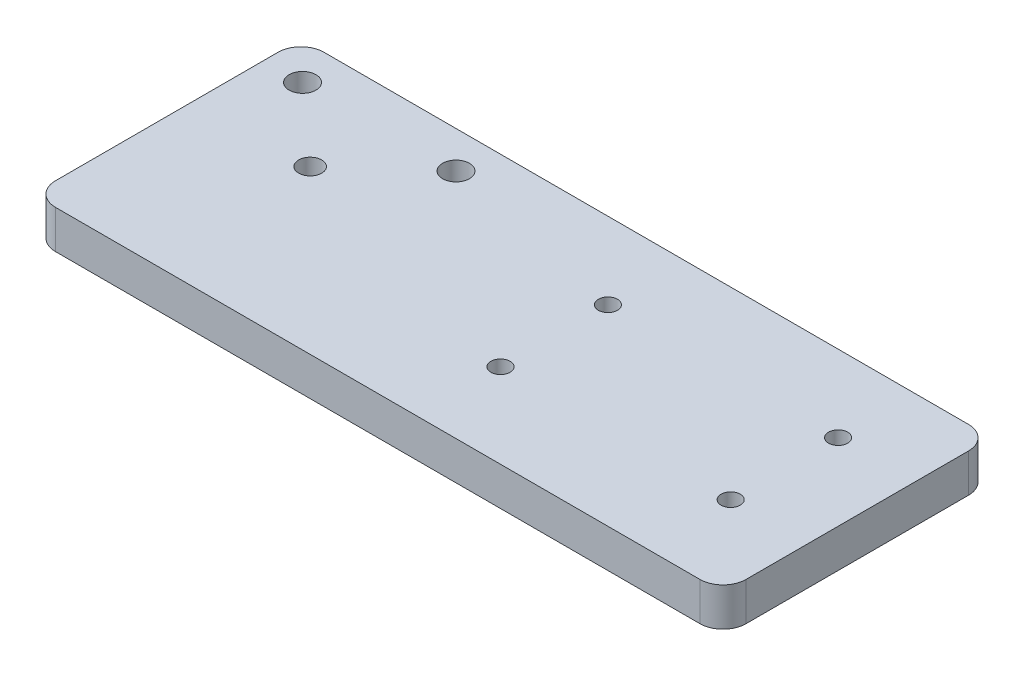
ISO-10303-21;
HEADER;
FILE_DESCRIPTION(('STEP AP214'),'2;1');
FILE_NAME('part.step','',(''),(''),'','','');
FILE_SCHEMA(('AUTOMOTIVE_DESIGN { 1 0 10303 214 1 1 1 1 }'));
ENDSEC;
DATA;
#1=APPLICATION_CONTEXT('core data for automotive mechanical design processes');
#2=APPLICATION_PROTOCOL_DEFINITION('international standard','automotive_design',2000,#1);
#3=PRODUCT_CONTEXT('',#1,'mechanical');
#4=PRODUCT('Part','Part','',(#3));
#5=PRODUCT_RELATED_PRODUCT_CATEGORY('part','',(#4));
#6=PRODUCT_DEFINITION_FORMATION('','',#4);
#7=PRODUCT_DEFINITION_CONTEXT('part definition',#1,'design');
#8=PRODUCT_DEFINITION('design','',#6,#7);
#9=PRODUCT_DEFINITION_SHAPE('','',#8);
#10=(LENGTH_UNIT() NAMED_UNIT(*) SI_UNIT(.MILLI.,.METRE.));
#11=(NAMED_UNIT(*) PLANE_ANGLE_UNIT() SI_UNIT($,.RADIAN.));
#12=(NAMED_UNIT(*) SI_UNIT($,.STERADIAN.) SOLID_ANGLE_UNIT());
#13=UNCERTAINTY_MEASURE_WITH_UNIT(LENGTH_MEASURE(1.E-05),#10,'distance_accuracy_value','');
#14=(GEOMETRIC_REPRESENTATION_CONTEXT(3) GLOBAL_UNCERTAINTY_ASSIGNED_CONTEXT((#13)) GLOBAL_UNIT_ASSIGNED_CONTEXT((#10,
#11,#12)) REPRESENTATION_CONTEXT('',''));
#15=CARTESIAN_POINT('',(0.,0.,0.));
#16=DIRECTION('',(0.,0.,1.));
#17=DIRECTION('',(1.,0.,0.));
#18=AXIS2_PLACEMENT_3D('',#15,#16,#17);
#19=CARTESIAN_POINT('',(-45.,5.,-17.5));
#20=DIRECTION('',(1.,0.,0.));
#21=DIRECTION('',(0.,0.,-1.));
#22=AXIS2_PLACEMENT_3D('',#19,#20,#21);
#23=PLANE('',#22);
#24=DIRECTION('',(0.,0.,1.));
#25=VECTOR('',#24,1.);
#26=CARTESIAN_POINT('',(-45.,5.,-17.5));
#27=LINE('',#26,#25);
#28=CARTESIAN_POINT('',(-45.,5.,-14.5));
#29=VERTEX_POINT('',#28);
#30=CARTESIAN_POINT('',(-45.,5.,14.5));
#31=VERTEX_POINT('',#30);
#32=EDGE_CURVE('E128',#29,#31,#27,.T.);
#33=ORIENTED_EDGE('',*,*,#32,.F.);
#34=DIRECTION('',(0.,-1.,0.));
#35=VECTOR('',#34,1.);
#36=CARTESIAN_POINT('',(-45.,0.,-14.5));
#37=LINE('',#36,#35);
#38=CARTESIAN_POINT('',(-45.,0.,-14.5));
#39=VERTEX_POINT('',#38);
#40=EDGE_CURVE('E133',#29,#39,#37,.T.);
#41=ORIENTED_EDGE('',*,*,#40,.T.);
#42=DIRECTION('',(0.,0.,1.));
#43=VECTOR('',#42,1.);
#44=CARTESIAN_POINT('',(-45.,0.,-17.5));
#45=LINE('',#44,#43);
#46=CARTESIAN_POINT('',(-45.,0.,14.5));
#47=VERTEX_POINT('',#46);
#48=EDGE_CURVE('E119',#39,#47,#45,.T.);
#49=ORIENTED_EDGE('',*,*,#48,.T.);
#50=DIRECTION('',(0.,-1.,0.));
#51=VECTOR('',#50,1.);
#52=CARTESIAN_POINT('',(-45.,5.,14.5));
#53=LINE('',#52,#51);
#54=EDGE_CURVE('E109',#47,#31,#53,.F.);
#55=ORIENTED_EDGE('',*,*,#54,.T.);
#56=EDGE_LOOP('',(#33,#41,#49,#55));
#57=FACE_BOUND('',#56,.T.);
#58=ADVANCED_FACE('F37',(#57),#23,.F.);
#59=CARTESIAN_POINT('',(-45.,5.,17.5));
#60=DIRECTION('',(0.,0.,-1.));
#61=DIRECTION('',(-1.,0.,0.));
#62=AXIS2_PLACEMENT_3D('',#59,#60,#61);
#63=PLANE('',#62);
#64=DIRECTION('',(1.,0.,0.));
#65=VECTOR('',#64,1.);
#66=CARTESIAN_POINT('',(-45.,0.,17.5));
#67=LINE('',#66,#65);
#68=CARTESIAN_POINT('',(-42.,0.,17.5));
#69=VERTEX_POINT('',#68);
#70=CARTESIAN_POINT('',(42.,0.,17.5));
#71=VERTEX_POINT('',#70);
#72=EDGE_CURVE('E113',#69,#71,#67,.T.);
#73=ORIENTED_EDGE('',*,*,#72,.T.);
#74=DIRECTION('',(0.,-1.,0.));
#75=VECTOR('',#74,1.);
#76=CARTESIAN_POINT('',(42.,5.,17.5));
#77=LINE('',#76,#75);
#78=CARTESIAN_POINT('',(42.,5.,17.5));
#79=VERTEX_POINT('',#78);
#80=EDGE_CURVE('E45',#71,#79,#77,.F.);
#81=ORIENTED_EDGE('',*,*,#80,.T.);
#82=DIRECTION('',(1.,0.,0.));
#83=VECTOR('',#82,1.);
#84=CARTESIAN_POINT('',(-45.,5.,17.5));
#85=LINE('',#84,#83);
#86=CARTESIAN_POINT('',(-42.,5.,17.5));
#87=VERTEX_POINT('',#86);
#88=EDGE_CURVE('E114',#87,#79,#85,.T.);
#89=ORIENTED_EDGE('',*,*,#88,.F.);
#90=DIRECTION('',(0.,-1.,0.));
#91=VECTOR('',#90,1.);
#92=CARTESIAN_POINT('',(-42.,5.,17.5));
#93=LINE('',#92,#91);
#94=EDGE_CURVE('E107',#87,#69,#93,.T.);
#95=ORIENTED_EDGE('',*,*,#94,.T.);
#96=EDGE_LOOP('',(#73,#81,#89,#95));
#97=FACE_BOUND('',#96,.T.);
#98=ADVANCED_FACE('F112',(#97),#63,.F.);
#99=CARTESIAN_POINT('',(45.,5.,-17.5));
#100=DIRECTION('',(1.,0.,0.));
#101=DIRECTION('',(0.,0.,-1.));
#102=AXIS2_PLACEMENT_3D('',#99,#100,#101);
#103=PLANE('',#102);
#104=DIRECTION('',(0.,0.,1.));
#105=VECTOR('',#104,1.);
#106=CARTESIAN_POINT('',(45.,5.,-17.5));
#107=LINE('',#106,#105);
#108=CARTESIAN_POINT('',(45.,5.,-14.5));
#109=VERTEX_POINT('',#108);
#110=CARTESIAN_POINT('',(45.,5.,14.5));
#111=VERTEX_POINT('',#110);
#112=EDGE_CURVE('E161',#109,#111,#107,.T.);
#113=ORIENTED_EDGE('',*,*,#112,.T.);
#114=DIRECTION('',(0.,-1.,0.));
#115=VECTOR('',#114,1.);
#116=CARTESIAN_POINT('',(45.,0.,14.5));
#117=LINE('',#116,#115);
#118=CARTESIAN_POINT('',(45.,0.,14.5));
#119=VERTEX_POINT('',#118);
#120=EDGE_CURVE('E151',#111,#119,#117,.T.);
#121=ORIENTED_EDGE('',*,*,#120,.T.);
#122=DIRECTION('',(0.,0.,1.));
#123=VECTOR('',#122,1.);
#124=CARTESIAN_POINT('',(45.,0.,-17.5));
#125=LINE('',#124,#123);
#126=CARTESIAN_POINT('',(45.,0.,-14.5));
#127=VERTEX_POINT('',#126);
#128=EDGE_CURVE('E118',#127,#119,#125,.T.);
#129=ORIENTED_EDGE('',*,*,#128,.F.);
#130=DIRECTION('',(0.,-1.,0.));
#131=VECTOR('',#130,1.);
#132=CARTESIAN_POINT('',(45.,5.,-14.5));
#133=LINE('',#132,#131);
#134=EDGE_CURVE('E147',#127,#109,#133,.F.);
#135=ORIENTED_EDGE('',*,*,#134,.T.);
#136=EDGE_LOOP('',(#113,#121,#129,#135));
#137=FACE_BOUND('',#136,.T.);
#138=ADVANCED_FACE('F158',(#137),#103,.T.);
#139=CARTESIAN_POINT('',(-45.,5.,-17.5));
#140=DIRECTION('',(0.,0.,-1.));
#141=DIRECTION('',(-1.,0.,0.));
#142=AXIS2_PLACEMENT_3D('',#139,#140,#141);
#143=PLANE('',#142);
#144=DIRECTION('',(1.,0.,0.));
#145=VECTOR('',#144,1.);
#146=CARTESIAN_POINT('',(-45.,5.,-17.5));
#147=LINE('',#146,#145);
#148=CARTESIAN_POINT('',(-42.,5.,-17.5));
#149=VERTEX_POINT('',#148);
#150=CARTESIAN_POINT('',(42.,5.,-17.5));
#151=VERTEX_POINT('',#150);
#152=EDGE_CURVE('E115',#149,#151,#147,.T.);
#153=ORIENTED_EDGE('',*,*,#152,.T.);
#154=DIRECTION('',(0.,-1.,0.));
#155=VECTOR('',#154,1.);
#156=CARTESIAN_POINT('',(42.,5.,-17.5));
#157=LINE('',#156,#155);
#158=CARTESIAN_POINT('',(42.,0.,-17.5));
#159=VERTEX_POINT('',#158);
#160=EDGE_CURVE('E142',#151,#159,#157,.T.);
#161=ORIENTED_EDGE('',*,*,#160,.T.);
#162=DIRECTION('',(1.,0.,0.));
#163=VECTOR('',#162,1.);
#164=CARTESIAN_POINT('',(-45.,0.,-17.5));
#165=LINE('',#164,#163);
#166=CARTESIAN_POINT('',(-42.,0.,-17.5));
#167=VERTEX_POINT('',#166);
#168=EDGE_CURVE('E121',#167,#159,#165,.T.);
#169=ORIENTED_EDGE('',*,*,#168,.F.);
#170=DIRECTION('',(0.,-1.,0.));
#171=VECTOR('',#170,1.);
#172=CARTESIAN_POINT('',(-42.,5.,-17.5));
#173=LINE('',#172,#171);
#174=EDGE_CURVE('E138',#167,#149,#173,.F.);
#175=ORIENTED_EDGE('',*,*,#174,.T.);
#176=EDGE_LOOP('',(#153,#161,#169,#175));
#177=FACE_BOUND('',#176,.T.);
#178=ADVANCED_FACE('F171',(#177),#143,.T.);
#179=CARTESIAN_POINT('',(0.,5.,0.));
#180=DIRECTION('',(0.,1.,0.));
#181=DIRECTION('',(0.,0.,1.));
#182=AXIS2_PLACEMENT_3D('',#179,#180,#181);
#183=PLANE('',#182);
#184=CARTESIAN_POINT('',(5.,5.,-7.49999999999999));
#185=DIRECTION('',(0.,1.,0.));
#186=DIRECTION('',(0.,0.,1.));
#187=AXIS2_PLACEMENT_3D('',#184,#185,#186);
#188=CIRCLE('',#187,1.24999999999999);
#189=CARTESIAN_POINT('',(5.,5.,-6.25));
#190=VERTEX_POINT('',#189);
#191=EDGE_CURVE('E218',#190,#190,#188,.T.);
#192=ORIENTED_EDGE('',*,*,#191,.F.);
#193=EDGE_LOOP('',(#192));
#194=FACE_BOUND('',#193,.T.);
#195=CARTESIAN_POINT('',(5.00000000000001,5.,6.50000000000001));
#196=DIRECTION('',(0.,1.,0.));
#197=DIRECTION('',(0.,0.,1.));
#198=AXIS2_PLACEMENT_3D('',#195,#196,#197);
#199=CIRCLE('',#198,1.24999999999999);
#200=CARTESIAN_POINT('',(5.00000000000001,5.,7.75));
#201=VERTEX_POINT('',#200);
#202=EDGE_CURVE('E212',#201,#201,#199,.T.);
#203=ORIENTED_EDGE('',*,*,#202,.F.);
#204=EDGE_LOOP('',(#203));
#205=FACE_BOUND('',#204,.T.);
#206=CARTESIAN_POINT('',(35.,5.,-7.49999999999999));
#207=DIRECTION('',(0.,1.,0.));
#208=DIRECTION('',(0.,0.,1.));
#209=AXIS2_PLACEMENT_3D('',#206,#207,#208);
#210=CIRCLE('',#209,1.24999999999999);
#211=CARTESIAN_POINT('',(35.,5.,-6.25));
#212=VERTEX_POINT('',#211);
#213=EDGE_CURVE('E206',#212,#212,#210,.T.);
#214=ORIENTED_EDGE('',*,*,#213,.F.);
#215=EDGE_LOOP('',(#214));
#216=FACE_BOUND('',#215,.T.);
#217=CARTESIAN_POINT('',(35.,5.,6.50000000000001));
#218=DIRECTION('',(0.,1.,0.));
#219=DIRECTION('',(0.,0.,1.));
#220=AXIS2_PLACEMENT_3D('',#217,#218,#219);
#221=CIRCLE('',#220,1.24999999999999);
#222=CARTESIAN_POINT('',(35.,5.,7.75));
#223=VERTEX_POINT('',#222);
#224=EDGE_CURVE('E200',#223,#223,#221,.T.);
#225=ORIENTED_EDGE('',*,*,#224,.F.);
#226=EDGE_LOOP('',(#225));
#227=FACE_BOUND('',#226,.T.);
#228=CARTESIAN_POINT('',(-30.,5.,-3.7));
#229=DIRECTION('',(0.,1.,0.));
#230=DIRECTION('',(0.,0.,1.));
#231=AXIS2_PLACEMENT_3D('',#228,#229,#230);
#232=CIRCLE('',#231,1.5);
#233=CARTESIAN_POINT('',(-30.,5.,-2.2));
#234=VERTEX_POINT('',#233);
#235=EDGE_CURVE('E192',#234,#234,#232,.T.);
#236=ORIENTED_EDGE('',*,*,#235,.F.);
#237=EDGE_LOOP('',(#236));
#238=FACE_BOUND('',#237,.T.);
#239=CARTESIAN_POINT('',(-40.,5.,-12.7));
#240=DIRECTION('',(0.,1.,0.));
#241=DIRECTION('',(0.,0.,1.));
#242=AXIS2_PLACEMENT_3D('',#239,#240,#241);
#243=CIRCLE('',#242,1.75);
#244=CARTESIAN_POINT('',(-40.,5.,-10.95));
#245=VERTEX_POINT('',#244);
#246=EDGE_CURVE('E186',#245,#245,#243,.T.);
#247=ORIENTED_EDGE('',*,*,#246,.F.);
#248=EDGE_LOOP('',(#247));
#249=FACE_BOUND('',#248,.T.);
#250=CARTESIAN_POINT('',(-20.,5.,-12.7));
#251=DIRECTION('',(0.,1.,0.));
#252=DIRECTION('',(0.,0.,1.));
#253=AXIS2_PLACEMENT_3D('',#250,#251,#252);
#254=CIRCLE('',#253,1.75);
#255=CARTESIAN_POINT('',(-20.,5.,-10.95));
#256=VERTEX_POINT('',#255);
#257=EDGE_CURVE('E180',#256,#256,#254,.T.);
#258=ORIENTED_EDGE('',*,*,#257,.F.);
#259=EDGE_LOOP('',(#258));
#260=FACE_BOUND('',#259,.T.);
#261=ORIENTED_EDGE('',*,*,#88,.T.);
#262=CARTESIAN_POINT('',(42.,5.,14.5));
#263=DIRECTION('',(0.,1.,0.));
#264=DIRECTION('',(0.,0.,1.));
#265=AXIS2_PLACEMENT_3D('',#262,#263,#264);
#266=CIRCLE('',#265,3.);
#267=EDGE_CURVE('E11',#79,#111,#266,.T.);
#268=ORIENTED_EDGE('',*,*,#267,.T.);
#269=ORIENTED_EDGE('',*,*,#112,.F.);
#270=CARTESIAN_POINT('',(42.,5.,-14.5));
#271=DIRECTION('',(0.,1.,0.));
#272=DIRECTION('',(0.,0.,1.));
#273=AXIS2_PLACEMENT_3D('',#270,#271,#272);
#274=CIRCLE('',#273,3.);
#275=EDGE_CURVE('E149',#109,#151,#274,.T.);
#276=ORIENTED_EDGE('',*,*,#275,.T.);
#277=ORIENTED_EDGE('',*,*,#152,.F.);
#278=CARTESIAN_POINT('',(-42.,5.,-14.5));
#279=DIRECTION('',(0.,1.,0.));
#280=DIRECTION('',(0.,0.,1.));
#281=AXIS2_PLACEMENT_3D('',#278,#279,#280);
#282=CIRCLE('',#281,3.);
#283=EDGE_CURVE('E140',#149,#29,#282,.T.);
#284=ORIENTED_EDGE('',*,*,#283,.T.);
#285=ORIENTED_EDGE('',*,*,#32,.T.);
#286=CARTESIAN_POINT('',(-42.,5.,14.5));
#287=DIRECTION('',(0.,1.,0.));
#288=DIRECTION('',(0.,0.,1.));
#289=AXIS2_PLACEMENT_3D('',#286,#287,#288);
#290=CIRCLE('',#289,3.);
#291=EDGE_CURVE('E131',#31,#87,#290,.T.);
#292=ORIENTED_EDGE('',*,*,#291,.T.);
#293=EDGE_LOOP('',(#261,#268,#269,#276,#277,#284,#285,#292));
#294=FACE_BOUND('',#293,.T.);
#295=ADVANCED_FACE('F224',(#194,#205,#216,#227,#238,#249,#260,#294),#183,.T.);
#296=CARTESIAN_POINT('',(0.,0.,0.));
#297=DIRECTION('',(0.,1.,0.));
#298=DIRECTION('',(0.,0.,1.));
#299=AXIS2_PLACEMENT_3D('',#296,#297,#298);
#300=PLANE('',#299);
#301=CARTESIAN_POINT('',(5.,0.,-7.49999999999999));
#302=DIRECTION('',(0.,1.,0.));
#303=DIRECTION('',(0.,0.,1.));
#304=AXIS2_PLACEMENT_3D('',#301,#302,#303);
#305=CIRCLE('',#304,1.24999999999999);
#306=CARTESIAN_POINT('',(5.,0.,-6.25));
#307=VERTEX_POINT('',#306);
#308=EDGE_CURVE('E215',#307,#307,#305,.T.);
#309=ORIENTED_EDGE('',*,*,#308,.T.);
#310=EDGE_LOOP('',(#309));
#311=FACE_BOUND('',#310,.T.);
#312=CARTESIAN_POINT('',(5.00000000000001,0.,6.50000000000001));
#313=DIRECTION('',(0.,1.,0.));
#314=DIRECTION('',(0.,0.,1.));
#315=AXIS2_PLACEMENT_3D('',#312,#313,#314);
#316=CIRCLE('',#315,1.24999999999999);
#317=CARTESIAN_POINT('',(5.00000000000001,0.,7.75));
#318=VERTEX_POINT('',#317);
#319=EDGE_CURVE('E209',#318,#318,#316,.T.);
#320=ORIENTED_EDGE('',*,*,#319,.T.);
#321=EDGE_LOOP('',(#320));
#322=FACE_BOUND('',#321,.T.);
#323=CARTESIAN_POINT('',(35.,0.,-7.49999999999999));
#324=DIRECTION('',(0.,1.,0.));
#325=DIRECTION('',(0.,0.,1.));
#326=AXIS2_PLACEMENT_3D('',#323,#324,#325);
#327=CIRCLE('',#326,1.24999999999999);
#328=CARTESIAN_POINT('',(35.,0.,-6.25));
#329=VERTEX_POINT('',#328);
#330=EDGE_CURVE('E203',#329,#329,#327,.T.);
#331=ORIENTED_EDGE('',*,*,#330,.T.);
#332=EDGE_LOOP('',(#331));
#333=FACE_BOUND('',#332,.T.);
#334=CARTESIAN_POINT('',(35.,0.,6.50000000000001));
#335=DIRECTION('',(0.,1.,0.));
#336=DIRECTION('',(0.,0.,1.));
#337=AXIS2_PLACEMENT_3D('',#334,#335,#336);
#338=CIRCLE('',#337,1.24999999999999);
#339=CARTESIAN_POINT('',(35.,0.,7.75));
#340=VERTEX_POINT('',#339);
#341=EDGE_CURVE('E195',#340,#340,#338,.T.);
#342=ORIENTED_EDGE('',*,*,#341,.T.);
#343=EDGE_LOOP('',(#342));
#344=FACE_BOUND('',#343,.T.);
#345=CARTESIAN_POINT('',(-30.,0.,-3.7));
#346=DIRECTION('',(0.,1.,0.));
#347=DIRECTION('',(0.,0.,1.));
#348=AXIS2_PLACEMENT_3D('',#345,#346,#347);
#349=CIRCLE('',#348,1.5);
#350=CARTESIAN_POINT('',(-30.,0.,-2.2));
#351=VERTEX_POINT('',#350);
#352=EDGE_CURVE('E189',#351,#351,#349,.T.);
#353=ORIENTED_EDGE('',*,*,#352,.T.);
#354=EDGE_LOOP('',(#353));
#355=FACE_BOUND('',#354,.T.);
#356=CARTESIAN_POINT('',(-40.,0.,-12.7));
#357=DIRECTION('',(0.,1.,0.));
#358=DIRECTION('',(0.,0.,1.));
#359=AXIS2_PLACEMENT_3D('',#356,#357,#358);
#360=CIRCLE('',#359,1.75);
#361=CARTESIAN_POINT('',(-40.,0.,-10.95));
#362=VERTEX_POINT('',#361);
#363=EDGE_CURVE('E183',#362,#362,#360,.T.);
#364=ORIENTED_EDGE('',*,*,#363,.T.);
#365=EDGE_LOOP('',(#364));
#366=FACE_BOUND('',#365,.T.);
#367=CARTESIAN_POINT('',(-20.,0.,-12.7));
#368=DIRECTION('',(0.,1.,0.));
#369=DIRECTION('',(0.,0.,1.));
#370=AXIS2_PLACEMENT_3D('',#367,#368,#369);
#371=CIRCLE('',#370,1.75);
#372=CARTESIAN_POINT('',(-20.,0.,-10.95));
#373=VERTEX_POINT('',#372);
#374=EDGE_CURVE('E123',#373,#373,#371,.T.);
#375=ORIENTED_EDGE('',*,*,#374,.T.);
#376=EDGE_LOOP('',(#375));
#377=FACE_BOUND('',#376,.T.);
#378=ORIENTED_EDGE('',*,*,#128,.T.);
#379=CARTESIAN_POINT('',(42.,0.,14.5));
#380=DIRECTION('',(0.,1.,0.));
#381=DIRECTION('',(0.,0.,1.));
#382=AXIS2_PLACEMENT_3D('',#379,#380,#381);
#383=CIRCLE('',#382,3.);
#384=EDGE_CURVE('E59',#119,#71,#383,.F.);
#385=ORIENTED_EDGE('',*,*,#384,.T.);
#386=ORIENTED_EDGE('',*,*,#72,.F.);
#387=CARTESIAN_POINT('',(-42.,0.,14.5));
#388=DIRECTION('',(0.,1.,0.));
#389=DIRECTION('',(0.,0.,1.));
#390=AXIS2_PLACEMENT_3D('',#387,#388,#389);
#391=CIRCLE('',#390,3.);
#392=EDGE_CURVE('E103',#69,#47,#391,.F.);
#393=ORIENTED_EDGE('',*,*,#392,.T.);
#394=ORIENTED_EDGE('',*,*,#48,.F.);
#395=CARTESIAN_POINT('',(-42.,0.,-14.5));
#396=DIRECTION('',(0.,1.,0.));
#397=DIRECTION('',(0.,0.,1.));
#398=AXIS2_PLACEMENT_3D('',#395,#396,#397);
#399=CIRCLE('',#398,3.);
#400=EDGE_CURVE('E136',#39,#167,#399,.F.);
#401=ORIENTED_EDGE('',*,*,#400,.T.);
#402=ORIENTED_EDGE('',*,*,#168,.T.);
#403=CARTESIAN_POINT('',(42.,0.,-14.5));
#404=DIRECTION('',(0.,1.,0.));
#405=DIRECTION('',(0.,0.,1.));
#406=AXIS2_PLACEMENT_3D('',#403,#404,#405);
#407=CIRCLE('',#406,3.);
#408=EDGE_CURVE('E145',#159,#127,#407,.F.);
#409=ORIENTED_EDGE('',*,*,#408,.T.);
#410=EDGE_LOOP('',(#378,#385,#386,#393,#394,#401,#402,#409));
#411=FACE_BOUND('',#410,.T.);
#412=ADVANCED_FACE('F117',(#311,#322,#333,#344,#355,#366,#377,#411),#300,.F.);
#413=CARTESIAN_POINT('',(-20.,0.,-12.7));
#414=DIRECTION('',(0.,1.,0.));
#415=DIRECTION('',(0.,0.,1.));
#416=AXIS2_PLACEMENT_3D('',#413,#414,#415);
#417=CYLINDRICAL_SURFACE('',#416,1.75);
#418=ORIENTED_EDGE('',*,*,#374,.F.);
#419=EDGE_LOOP('',(#418));
#420=FACE_BOUND('',#419,.T.);
#421=ORIENTED_EDGE('',*,*,#257,.T.);
#422=EDGE_LOOP('',(#421));
#423=FACE_BOUND('',#422,.T.);
#424=ADVANCED_FACE('F312',(#420,#423),#417,.F.);
#425=CARTESIAN_POINT('',(-40.,0.,-12.7));
#426=DIRECTION('',(0.,1.,0.));
#427=DIRECTION('',(0.,0.,1.));
#428=AXIS2_PLACEMENT_3D('',#425,#426,#427);
#429=CYLINDRICAL_SURFACE('',#428,1.75);
#430=ORIENTED_EDGE('',*,*,#363,.F.);
#431=EDGE_LOOP('',(#430));
#432=FACE_BOUND('',#431,.T.);
#433=ORIENTED_EDGE('',*,*,#246,.T.);
#434=EDGE_LOOP('',(#433));
#435=FACE_BOUND('',#434,.T.);
#436=ADVANCED_FACE('F363',(#432,#435),#429,.F.);
#437=CARTESIAN_POINT('',(-30.,0.,-3.7));
#438=DIRECTION('',(0.,1.,0.));
#439=DIRECTION('',(0.,0.,1.));
#440=AXIS2_PLACEMENT_3D('',#437,#438,#439);
#441=CYLINDRICAL_SURFACE('',#440,1.5);
#442=ORIENTED_EDGE('',*,*,#352,.F.);
#443=EDGE_LOOP('',(#442));
#444=FACE_BOUND('',#443,.T.);
#445=ORIENTED_EDGE('',*,*,#235,.T.);
#446=EDGE_LOOP('',(#445));
#447=FACE_BOUND('',#446,.T.);
#448=ADVANCED_FACE('F261',(#444,#447),#441,.F.);
#449=CARTESIAN_POINT('',(-42.,5.,14.5));
#450=DIRECTION('',(0.,-1.,0.));
#451=DIRECTION('',(0.,0.,-1.));
#452=AXIS2_PLACEMENT_3D('',#449,#450,#451);
#453=CYLINDRICAL_SURFACE('',#452,3.);
#454=ORIENTED_EDGE('',*,*,#291,.F.);
#455=ORIENTED_EDGE('',*,*,#54,.F.);
#456=ORIENTED_EDGE('',*,*,#392,.F.);
#457=ORIENTED_EDGE('',*,*,#94,.F.);
#458=EDGE_LOOP('',(#454,#455,#456,#457));
#459=FACE_BOUND('',#458,.T.);
#460=ADVANCED_FACE('F106',(#459),#453,.T.);
#461=CARTESIAN_POINT('',(-42.,5.,-14.5));
#462=DIRECTION('',(0.,1.,0.));
#463=DIRECTION('',(0.,0.,1.));
#464=AXIS2_PLACEMENT_3D('',#461,#462,#463);
#465=CYLINDRICAL_SURFACE('',#464,3.);
#466=ORIENTED_EDGE('',*,*,#283,.F.);
#467=ORIENTED_EDGE('',*,*,#174,.F.);
#468=ORIENTED_EDGE('',*,*,#400,.F.);
#469=ORIENTED_EDGE('',*,*,#40,.F.);
#470=EDGE_LOOP('',(#466,#467,#468,#469));
#471=FACE_BOUND('',#470,.T.);
#472=ADVANCED_FACE('F248',(#471),#465,.T.);
#473=CARTESIAN_POINT('',(42.,5.,-14.5));
#474=DIRECTION('',(0.,-1.,0.));
#475=DIRECTION('',(0.,0.,-1.));
#476=AXIS2_PLACEMENT_3D('',#473,#474,#475);
#477=CYLINDRICAL_SURFACE('',#476,3.);
#478=ORIENTED_EDGE('',*,*,#275,.F.);
#479=ORIENTED_EDGE('',*,*,#134,.F.);
#480=ORIENTED_EDGE('',*,*,#408,.F.);
#481=ORIENTED_EDGE('',*,*,#160,.F.);
#482=EDGE_LOOP('',(#478,#479,#480,#481));
#483=FACE_BOUND('',#482,.T.);
#484=ADVANCED_FACE('F168',(#483),#477,.T.);
#485=CARTESIAN_POINT('',(42.,5.,14.5));
#486=DIRECTION('',(0.,1.,0.));
#487=DIRECTION('',(0.,0.,1.));
#488=AXIS2_PLACEMENT_3D('',#485,#486,#487);
#489=CYLINDRICAL_SURFACE('',#488,3.);
#490=ORIENTED_EDGE('',*,*,#267,.F.);
#491=ORIENTED_EDGE('',*,*,#80,.F.);
#492=ORIENTED_EDGE('',*,*,#384,.F.);
#493=ORIENTED_EDGE('',*,*,#120,.F.);
#494=EDGE_LOOP('',(#490,#491,#492,#493));
#495=FACE_BOUND('',#494,.T.);
#496=ADVANCED_FACE('F39',(#495),#489,.T.);
#497=CARTESIAN_POINT('',(35.,5.,6.50000000000001));
#498=DIRECTION('',(0.,1.,0.));
#499=DIRECTION('',(0.,0.,1.));
#500=AXIS2_PLACEMENT_3D('',#497,#498,#499);
#501=CYLINDRICAL_SURFACE('',#500,1.24999999999999);
#502=ORIENTED_EDGE('',*,*,#341,.F.);
#503=EDGE_LOOP('',(#502));
#504=FACE_BOUND('',#503,.T.);
#505=ORIENTED_EDGE('',*,*,#224,.T.);
#506=EDGE_LOOP('',(#505));
#507=FACE_BOUND('',#506,.T.);
#508=ADVANCED_FACE('F240',(#504,#507),#501,.F.);
#509=CARTESIAN_POINT('',(35.,5.,-7.49999999999999));
#510=DIRECTION('',(0.,1.,0.));
#511=DIRECTION('',(0.,0.,1.));
#512=AXIS2_PLACEMENT_3D('',#509,#510,#511);
#513=CYLINDRICAL_SURFACE('',#512,1.24999999999999);
#514=ORIENTED_EDGE('',*,*,#330,.F.);
#515=EDGE_LOOP('',(#514));
#516=FACE_BOUND('',#515,.T.);
#517=ORIENTED_EDGE('',*,*,#213,.T.);
#518=EDGE_LOOP('',(#517));
#519=FACE_BOUND('',#518,.T.);
#520=ADVANCED_FACE('F245',(#516,#519),#513,.F.);
#521=CARTESIAN_POINT('',(5.00000000000001,5.,6.50000000000001));
#522=DIRECTION('',(0.,1.,0.));
#523=DIRECTION('',(0.,0.,1.));
#524=AXIS2_PLACEMENT_3D('',#521,#522,#523);
#525=CYLINDRICAL_SURFACE('',#524,1.24999999999999);
#526=ORIENTED_EDGE('',*,*,#319,.F.);
#527=EDGE_LOOP('',(#526));
#528=FACE_BOUND('',#527,.T.);
#529=ORIENTED_EDGE('',*,*,#202,.T.);
#530=EDGE_LOOP('',(#529));
#531=FACE_BOUND('',#530,.T.);
#532=ADVANCED_FACE('F331',(#528,#531),#525,.F.);
#533=CARTESIAN_POINT('',(5.,5.,-7.49999999999999));
#534=DIRECTION('',(0.,1.,0.));
#535=DIRECTION('',(0.,0.,1.));
#536=AXIS2_PLACEMENT_3D('',#533,#534,#535);
#537=CYLINDRICAL_SURFACE('',#536,1.24999999999999);
#538=ORIENTED_EDGE('',*,*,#308,.F.);
#539=EDGE_LOOP('',(#538));
#540=FACE_BOUND('',#539,.T.);
#541=ORIENTED_EDGE('',*,*,#191,.T.);
#542=EDGE_LOOP('',(#541));
#543=FACE_BOUND('',#542,.T.);
#544=ADVANCED_FACE('F222',(#540,#543),#537,.F.);
#545=CLOSED_SHELL('',(#58,#98,#138,#178,#295,#412,#424,#436,#448,#460,#472,#484,#496,#508,#520,
#532,#544));
#546=MANIFOLD_SOLID_BREP('B2',#545);
#547=ADVANCED_BREP_SHAPE_REPRESENTATION('',(#18,#546),#14);
#548=SHAPE_DEFINITION_REPRESENTATION(#9,#547);
ENDSEC;
END-ISO-10303-21;
